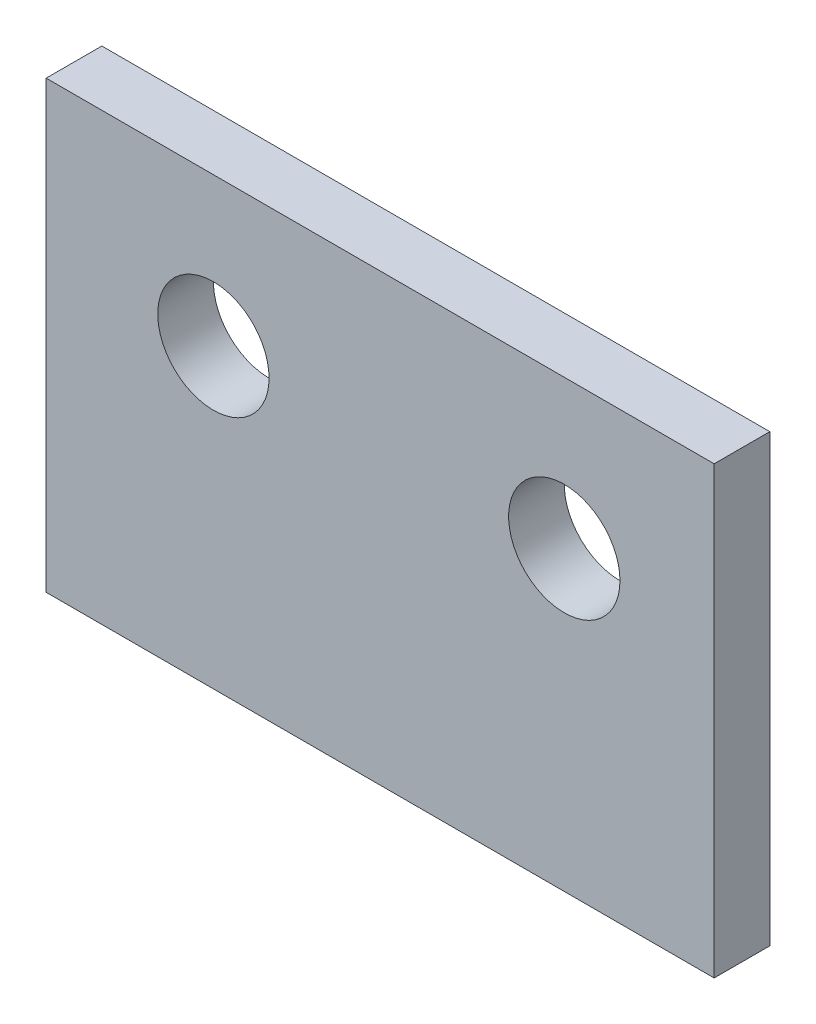
ISO-10303-21;
HEADER;
FILE_DESCRIPTION(('STEP AP214'),'2;1');
FILE_NAME('part.step','',(''),(''),'','','');
FILE_SCHEMA(('AUTOMOTIVE_DESIGN { 1 0 10303 214 1 1 1 1 }'));
ENDSEC;
DATA;
#1=APPLICATION_CONTEXT('core data for automotive mechanical design processes');
#2=APPLICATION_PROTOCOL_DEFINITION('international standard','automotive_design',2000,#1);
#3=PRODUCT_CONTEXT('',#1,'mechanical');
#4=PRODUCT('Part','Part','',(#3));
#5=PRODUCT_RELATED_PRODUCT_CATEGORY('part','',(#4));
#6=PRODUCT_DEFINITION_FORMATION('','',#4);
#7=PRODUCT_DEFINITION_CONTEXT('part definition',#1,'design');
#8=PRODUCT_DEFINITION('design','',#6,#7);
#9=PRODUCT_DEFINITION_SHAPE('','',#8);
#10=(LENGTH_UNIT() NAMED_UNIT(*) SI_UNIT(.MILLI.,.METRE.));
#11=(NAMED_UNIT(*) PLANE_ANGLE_UNIT() SI_UNIT($,.RADIAN.));
#12=(NAMED_UNIT(*) SI_UNIT($,.STERADIAN.) SOLID_ANGLE_UNIT());
#13=UNCERTAINTY_MEASURE_WITH_UNIT(LENGTH_MEASURE(1.E-05),#10,'distance_accuracy_value','');
#14=(GEOMETRIC_REPRESENTATION_CONTEXT(3) GLOBAL_UNCERTAINTY_ASSIGNED_CONTEXT((#13)) GLOBAL_UNIT_ASSIGNED_CONTEXT((#10,
#11,#12)) REPRESENTATION_CONTEXT('',''));
#15=CARTESIAN_POINT('',(0.,0.,0.));
#16=DIRECTION('',(0.,0.,1.));
#17=DIRECTION('',(1.,0.,0.));
#18=AXIS2_PLACEMENT_3D('',#15,#16,#17);
#19=CARTESIAN_POINT('',(0.,0.,5.));
#20=DIRECTION('',(0.,0.,1.));
#21=DIRECTION('',(1.,0.,0.));
#22=AXIS2_PLACEMENT_3D('',#19,#20,#21);
#23=PLANE('',#22);
#24=CARTESIAN_POINT('',(15.0205198358413,26.6757865937072,5.));
#25=DIRECTION('',(0.,0.,1.));
#26=DIRECTION('',(1.,0.,0.));
#27=AXIS2_PLACEMENT_3D('',#24,#25,#26);
#28=CIRCLE('',#27,5.);
#29=CARTESIAN_POINT('',(20.0205198358413,26.6757865937072,5.));
#30=VERTEX_POINT('',#29);
#31=EDGE_CURVE('E146',#30,#30,#28,.T.);
#32=ORIENTED_EDGE('',*,*,#31,.F.);
#33=EDGE_LOOP('',(#32));
#34=FACE_BOUND('',#33,.T.);
#35=DIRECTION('',(1.,0.,0.));
#36=VECTOR('',#35,1.);
#37=CARTESIAN_POINT('',(0.,40.,5.));
#38=LINE('',#37,#36);
#39=CARTESIAN_POINT('',(0.,40.,5.));
#40=VERTEX_POINT('',#39);
#41=CARTESIAN_POINT('',(60.,40.,5.));
#42=VERTEX_POINT('',#41);
#43=EDGE_CURVE('E132',#40,#42,#38,.T.);
#44=ORIENTED_EDGE('',*,*,#43,.F.);
#45=DIRECTION('',(0.,1.,0.));
#46=VECTOR('',#45,1.);
#47=CARTESIAN_POINT('',(0.,0.,5.));
#48=LINE('',#47,#46);
#49=CARTESIAN_POINT('',(0.,0.,5.));
#50=VERTEX_POINT('',#49);
#51=EDGE_CURVE('E119',#50,#40,#48,.T.);
#52=ORIENTED_EDGE('',*,*,#51,.F.);
#53=DIRECTION('',(1.,0.,0.));
#54=VECTOR('',#53,1.);
#55=CARTESIAN_POINT('',(0.,0.,5.));
#56=LINE('',#55,#54);
#57=CARTESIAN_POINT('',(60.,0.,5.));
#58=VERTEX_POINT('',#57);
#59=EDGE_CURVE('E116',#50,#58,#56,.T.);
#60=ORIENTED_EDGE('',*,*,#59,.T.);
#61=DIRECTION('',(0.,1.,0.));
#62=VECTOR('',#61,1.);
#63=CARTESIAN_POINT('',(60.,0.,5.));
#64=LINE('',#63,#62);
#65=EDGE_CURVE('E113',#58,#42,#64,.T.);
#66=ORIENTED_EDGE('',*,*,#65,.T.);
#67=EDGE_LOOP('',(#44,#52,#60,#66));
#68=FACE_BOUND('',#67,.T.);
#69=CARTESIAN_POINT('',(46.5389876880984,26.6757865937072,5.));
#70=DIRECTION('',(0.,0.,1.));
#71=DIRECTION('',(1.,0.,0.));
#72=AXIS2_PLACEMENT_3D('',#69,#70,#71);
#73=CIRCLE('',#72,5.);
#74=CARTESIAN_POINT('',(51.5389876880984,26.6757865937072,5.));
#75=VERTEX_POINT('',#74);
#76=EDGE_CURVE('E188',#75,#75,#73,.T.);
#77=ORIENTED_EDGE('',*,*,#76,.F.);
#78=EDGE_LOOP('',(#77));
#79=FACE_BOUND('',#78,.T.);
#80=ADVANCED_FACE('F69',(#34,#68,#79),#23,.T.);
#81=CARTESIAN_POINT('',(0.,0.,0.));
#82=DIRECTION('',(0.,0.,1.));
#83=DIRECTION('',(1.,0.,0.));
#84=AXIS2_PLACEMENT_3D('',#81,#82,#83);
#85=PLANE('',#84);
#86=DIRECTION('',(1.,0.,0.));
#87=VECTOR('',#86,1.);
#88=CARTESIAN_POINT('',(0.,40.,0.));
#89=LINE('',#88,#87);
#90=CARTESIAN_POINT('',(0.,40.,0.));
#91=VERTEX_POINT('',#90);
#92=CARTESIAN_POINT('',(60.,40.,0.));
#93=VERTEX_POINT('',#92);
#94=EDGE_CURVE('E141',#91,#93,#89,.T.);
#95=ORIENTED_EDGE('',*,*,#94,.T.);
#96=DIRECTION('',(0.,1.,0.));
#97=VECTOR('',#96,1.);
#98=CARTESIAN_POINT('',(60.,0.,0.));
#99=LINE('',#98,#97);
#100=CARTESIAN_POINT('',(60.,0.,0.));
#101=VERTEX_POINT('',#100);
#102=EDGE_CURVE('E145',#101,#93,#99,.T.);
#103=ORIENTED_EDGE('',*,*,#102,.F.);
#104=DIRECTION('',(1.,0.,0.));
#105=VECTOR('',#104,1.);
#106=CARTESIAN_POINT('',(0.,0.,0.));
#107=LINE('',#106,#105);
#108=CARTESIAN_POINT('',(0.,0.,0.));
#109=VERTEX_POINT('',#108);
#110=EDGE_CURVE('E125',#109,#101,#107,.T.);
#111=ORIENTED_EDGE('',*,*,#110,.F.);
#112=DIRECTION('',(0.,1.,0.));
#113=VECTOR('',#112,1.);
#114=CARTESIAN_POINT('',(0.,0.,0.));
#115=LINE('',#114,#113);
#116=EDGE_CURVE('E135',#109,#91,#115,.T.);
#117=ORIENTED_EDGE('',*,*,#116,.T.);
#118=EDGE_LOOP('',(#95,#103,#111,#117));
#119=FACE_BOUND('',#118,.T.);
#120=CARTESIAN_POINT('',(15.0205198358413,26.6757865937072,0.));
#121=DIRECTION('',(0.,0.,1.));
#122=DIRECTION('',(1.,0.,0.));
#123=AXIS2_PLACEMENT_3D('',#120,#121,#122);
#124=CIRCLE('',#123,5.);
#125=CARTESIAN_POINT('',(20.0205198358413,26.6757865937072,0.));
#126=VERTEX_POINT('',#125);
#127=EDGE_CURVE('E196',#126,#126,#124,.T.);
#128=ORIENTED_EDGE('',*,*,#127,.T.);
#129=EDGE_LOOP('',(#128));
#130=FACE_BOUND('',#129,.T.);
#131=CARTESIAN_POINT('',(46.5389876880984,26.6757865937072,0.));
#132=DIRECTION('',(0.,0.,1.));
#133=DIRECTION('',(1.,0.,0.));
#134=AXIS2_PLACEMENT_3D('',#131,#132,#133);
#135=CIRCLE('',#134,5.);
#136=CARTESIAN_POINT('',(51.5389876880984,26.6757865937072,0.));
#137=VERTEX_POINT('',#136);
#138=EDGE_CURVE('E191',#137,#137,#135,.T.);
#139=ORIENTED_EDGE('',*,*,#138,.T.);
#140=EDGE_LOOP('',(#139));
#141=FACE_BOUND('',#140,.T.);
#142=ADVANCED_FACE('F157',(#119,#130,#141),#85,.F.);
#143=CARTESIAN_POINT('',(0.,40.,5.));
#144=DIRECTION('',(0.,1.,0.));
#145=DIRECTION('',(0.,0.,1.));
#146=AXIS2_PLACEMENT_3D('',#143,#144,#145);
#147=PLANE('',#146);
#148=ORIENTED_EDGE('',*,*,#94,.F.);
#149=DIRECTION('',(0.,0.,-1.));
#150=VECTOR('',#149,1.);
#151=CARTESIAN_POINT('',(0.,40.,5.));
#152=LINE('',#151,#150);
#153=EDGE_CURVE('E12',#40,#91,#152,.T.);
#154=ORIENTED_EDGE('',*,*,#153,.F.);
#155=ORIENTED_EDGE('',*,*,#43,.T.);
#156=DIRECTION('',(0.,0.,-1.));
#157=VECTOR('',#156,1.);
#158=CARTESIAN_POINT('',(60.,40.,5.));
#159=LINE('',#158,#157);
#160=EDGE_CURVE('E73',#42,#93,#159,.T.);
#161=ORIENTED_EDGE('',*,*,#160,.T.);
#162=EDGE_LOOP('',(#148,#154,#155,#161));
#163=FACE_BOUND('',#162,.T.);
#164=ADVANCED_FACE('F71',(#163),#147,.T.);
#165=CARTESIAN_POINT('',(0.,0.,5.));
#166=DIRECTION('',(-1.,0.,0.));
#167=DIRECTION('',(0.,0.,1.));
#168=AXIS2_PLACEMENT_3D('',#165,#166,#167);
#169=PLANE('',#168);
#170=ORIENTED_EDGE('',*,*,#116,.F.);
#171=DIRECTION('',(0.,0.,-1.));
#172=VECTOR('',#171,1.);
#173=CARTESIAN_POINT('',(0.,0.,5.));
#174=LINE('',#173,#172);
#175=EDGE_CURVE('E80',#50,#109,#174,.T.);
#176=ORIENTED_EDGE('',*,*,#175,.F.);
#177=ORIENTED_EDGE('',*,*,#51,.T.);
#178=ORIENTED_EDGE('',*,*,#153,.T.);
#179=EDGE_LOOP('',(#170,#176,#177,#178));
#180=FACE_BOUND('',#179,.T.);
#181=ADVANCED_FACE('F159',(#180),#169,.T.);
#182=CARTESIAN_POINT('',(0.,0.,5.));
#183=DIRECTION('',(0.,1.,0.));
#184=DIRECTION('',(0.,0.,1.));
#185=AXIS2_PLACEMENT_3D('',#182,#183,#184);
#186=PLANE('',#185);
#187=ORIENTED_EDGE('',*,*,#110,.T.);
#188=DIRECTION('',(0.,0.,-1.));
#189=VECTOR('',#188,1.);
#190=CARTESIAN_POINT('',(60.,0.,5.));
#191=LINE('',#190,#189);
#192=EDGE_CURVE('E123',#58,#101,#191,.T.);
#193=ORIENTED_EDGE('',*,*,#192,.F.);
#194=ORIENTED_EDGE('',*,*,#59,.F.);
#195=ORIENTED_EDGE('',*,*,#175,.T.);
#196=EDGE_LOOP('',(#187,#193,#194,#195));
#197=FACE_BOUND('',#196,.T.);
#198=ADVANCED_FACE('F124',(#197),#186,.F.);
#199=CARTESIAN_POINT('',(60.,0.,5.));
#200=DIRECTION('',(-1.,0.,0.));
#201=DIRECTION('',(0.,0.,1.));
#202=AXIS2_PLACEMENT_3D('',#199,#200,#201);
#203=PLANE('',#202);
#204=ORIENTED_EDGE('',*,*,#102,.T.);
#205=ORIENTED_EDGE('',*,*,#160,.F.);
#206=ORIENTED_EDGE('',*,*,#65,.F.);
#207=ORIENTED_EDGE('',*,*,#192,.T.);
#208=EDGE_LOOP('',(#204,#205,#206,#207));
#209=FACE_BOUND('',#208,.T.);
#210=ADVANCED_FACE('F130',(#209),#203,.F.);
#211=CARTESIAN_POINT('',(15.0205198358413,26.6757865937072,5.));
#212=DIRECTION('',(0.,0.,-1.));
#213=DIRECTION('',(-1.,0.,0.));
#214=AXIS2_PLACEMENT_3D('',#211,#212,#213);
#215=CYLINDRICAL_SURFACE('',#214,5.);
#216=ORIENTED_EDGE('',*,*,#31,.T.);
#217=EDGE_LOOP('',(#216));
#218=FACE_BOUND('',#217,.T.);
#219=ORIENTED_EDGE('',*,*,#127,.F.);
#220=EDGE_LOOP('',(#219));
#221=FACE_BOUND('',#220,.T.);
#222=ADVANCED_FACE('F176',(#218,#221),#215,.F.);
#223=CARTESIAN_POINT('',(46.5389876880984,26.6757865937072,5.));
#224=DIRECTION('',(0.,0.,-1.));
#225=DIRECTION('',(-1.,0.,0.));
#226=AXIS2_PLACEMENT_3D('',#223,#224,#225);
#227=CYLINDRICAL_SURFACE('',#226,5.);
#228=ORIENTED_EDGE('',*,*,#76,.T.);
#229=EDGE_LOOP('',(#228));
#230=FACE_BOUND('',#229,.T.);
#231=ORIENTED_EDGE('',*,*,#138,.F.);
#232=EDGE_LOOP('',(#231));
#233=FACE_BOUND('',#232,.T.);
#234=ADVANCED_FACE('F179',(#230,#233),#227,.F.);
#235=CLOSED_SHELL('',(#80,#142,#164,#181,#198,#210,#222,#234));
#236=MANIFOLD_SOLID_BREP('B2',#235);
#237=ADVANCED_BREP_SHAPE_REPRESENTATION('',(#18,#236),#14);
#238=SHAPE_DEFINITION_REPRESENTATION(#9,#237);
ENDSEC;
END-ISO-10303-21;
